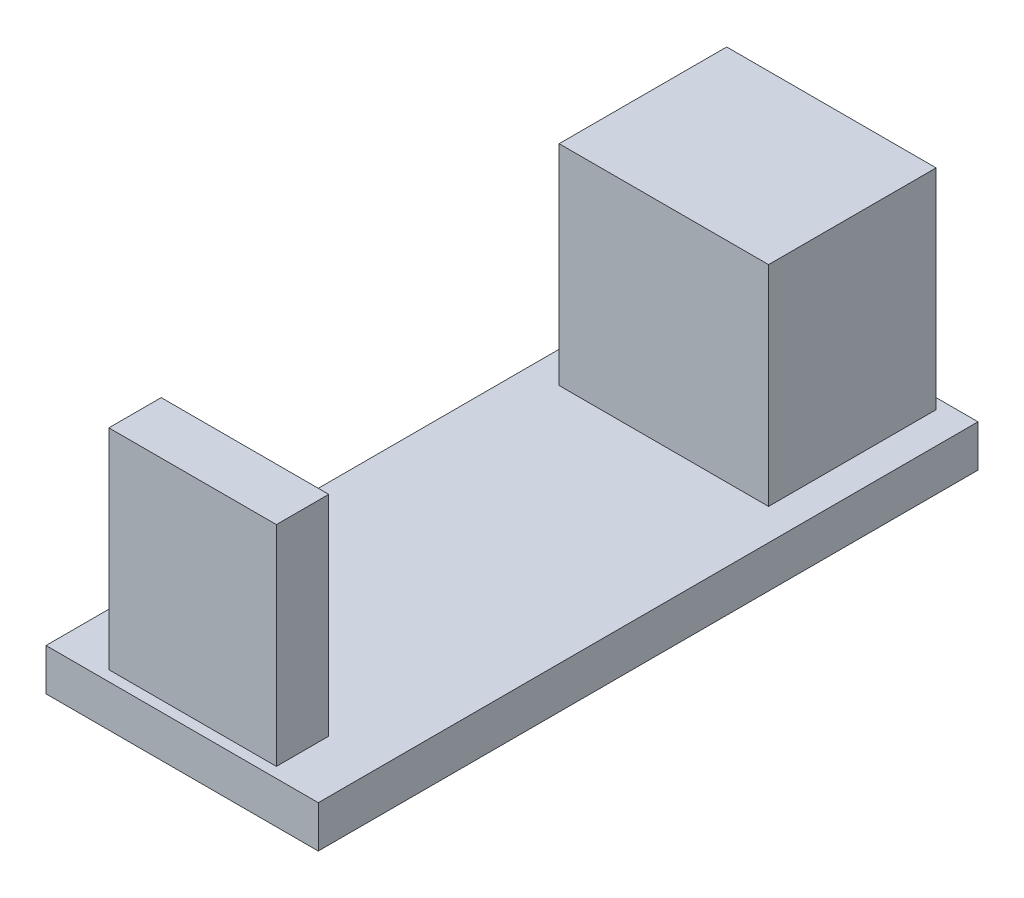
ISO-10303-21;
HEADER;
FILE_DESCRIPTION(('STEP AP214'),'2;1');
FILE_NAME('part.step','',(''),(''),'','','');
FILE_SCHEMA(('AUTOMOTIVE_DESIGN { 1 0 10303 214 1 1 1 1 }'));
ENDSEC;
DATA;
#1=APPLICATION_CONTEXT('core data for automotive mechanical design processes');
#2=APPLICATION_PROTOCOL_DEFINITION('international standard','automotive_design',2000,#1);
#3=PRODUCT_CONTEXT('',#1,'mechanical');
#4=PRODUCT('Part','Part','',(#3));
#5=PRODUCT_RELATED_PRODUCT_CATEGORY('part','',(#4));
#6=PRODUCT_DEFINITION_FORMATION('','',#4);
#7=PRODUCT_DEFINITION_CONTEXT('part definition',#1,'design');
#8=PRODUCT_DEFINITION('design','',#6,#7);
#9=PRODUCT_DEFINITION_SHAPE('','',#8);
#10=(LENGTH_UNIT() NAMED_UNIT(*) SI_UNIT(.MILLI.,.METRE.));
#11=(NAMED_UNIT(*) PLANE_ANGLE_UNIT() SI_UNIT($,.RADIAN.));
#12=(NAMED_UNIT(*) SI_UNIT($,.STERADIAN.) SOLID_ANGLE_UNIT());
#13=UNCERTAINTY_MEASURE_WITH_UNIT(LENGTH_MEASURE(1.E-05),#10,'distance_accuracy_value','');
#14=(GEOMETRIC_REPRESENTATION_CONTEXT(3) GLOBAL_UNCERTAINTY_ASSIGNED_CONTEXT((#13)) GLOBAL_UNIT_ASSIGNED_CONTEXT((#10,
#11,#12)) REPRESENTATION_CONTEXT('',''));
#15=CARTESIAN_POINT('',(0.,0.,0.));
#16=DIRECTION('',(0.,0.,1.));
#17=DIRECTION('',(1.,0.,0.));
#18=AXIS2_PLACEMENT_3D('',#15,#16,#17);
#19=CARTESIAN_POINT('',(0.,2.,0.));
#20=DIRECTION('',(0.,1.,0.));
#21=DIRECTION('',(0.,0.,1.));
#22=AXIS2_PLACEMENT_3D('',#19,#20,#21);
#23=PLANE('',#22);
#24=DIRECTION('',(0.,0.,-1.));
#25=VECTOR('',#24,1.);
#26=CARTESIAN_POINT('',(6.5,2.,-15.75));
#27=LINE('',#26,#25);
#28=CARTESIAN_POINT('',(6.5,2.,15.75));
#29=VERTEX_POINT('',#28);
#30=CARTESIAN_POINT('',(6.5,2.,-15.75));
#31=VERTEX_POINT('',#30);
#32=EDGE_CURVE('E179',#29,#31,#27,.T.);
#33=ORIENTED_EDGE('',*,*,#32,.T.);
#34=DIRECTION('',(-1.,0.,0.));
#35=VECTOR('',#34,1.);
#36=CARTESIAN_POINT('',(-6.5,2.,-15.75));
#37=LINE('',#36,#35);
#38=CARTESIAN_POINT('',(-6.5,2.,-15.75));
#39=VERTEX_POINT('',#38);
#40=EDGE_CURVE('E182',#31,#39,#37,.T.);
#41=ORIENTED_EDGE('',*,*,#40,.T.);
#42=DIRECTION('',(0.,0.,1.));
#43=VECTOR('',#42,1.);
#44=CARTESIAN_POINT('',(-6.5,2.,-15.75));
#45=LINE('',#44,#43);
#46=CARTESIAN_POINT('',(-6.5,2.,15.75));
#47=VERTEX_POINT('',#46);
#48=EDGE_CURVE('E185',#39,#47,#45,.T.);
#49=ORIENTED_EDGE('',*,*,#48,.T.);
#50=DIRECTION('',(1.,0.,0.));
#51=VECTOR('',#50,1.);
#52=CARTESIAN_POINT('',(-6.5,2.,15.75));
#53=LINE('',#52,#51);
#54=EDGE_CURVE('E187',#47,#29,#53,.T.);
#55=ORIENTED_EDGE('',*,*,#54,.T.);
#56=EDGE_LOOP('',(#33,#41,#49,#55));
#57=FACE_BOUND('',#56,.T.);
#58=DIRECTION('',(-1.,0.,0.));
#59=VECTOR('',#58,1.);
#60=CARTESIAN_POINT('',(-5.,2.,-15.25));
#61=LINE('',#60,#59);
#62=CARTESIAN_POINT('',(5.,2.,-15.25));
#63=VERTEX_POINT('',#62);
#64=CARTESIAN_POINT('',(-5.,2.,-15.25));
#65=VERTEX_POINT('',#64);
#66=EDGE_CURVE('E150',#63,#65,#61,.T.);
#67=ORIENTED_EDGE('',*,*,#66,.F.);
#68=DIRECTION('',(0.,0.,-1.));
#69=VECTOR('',#68,1.);
#70=CARTESIAN_POINT('',(5.,2.,-7.25));
#71=LINE('',#70,#69);
#72=CARTESIAN_POINT('',(5.,2.,-7.25));
#73=VERTEX_POINT('',#72);
#74=EDGE_CURVE('E147',#73,#63,#71,.T.);
#75=ORIENTED_EDGE('',*,*,#74,.F.);
#76=DIRECTION('',(1.,0.,0.));
#77=VECTOR('',#76,1.);
#78=CARTESIAN_POINT('',(-5.,2.,-7.25));
#79=LINE('',#78,#77);
#80=CARTESIAN_POINT('',(-5.,2.,-7.25));
#81=VERTEX_POINT('',#80);
#82=EDGE_CURVE('E159',#81,#73,#79,.T.);
#83=ORIENTED_EDGE('',*,*,#82,.F.);
#84=DIRECTION('',(0.,0.,1.));
#85=VECTOR('',#84,1.);
#86=CARTESIAN_POINT('',(-5.,2.,-7.25));
#87=LINE('',#86,#85);
#88=EDGE_CURVE('E167',#65,#81,#87,.T.);
#89=ORIENTED_EDGE('',*,*,#88,.F.);
#90=EDGE_LOOP('',(#67,#75,#83,#89));
#91=FACE_BOUND('',#90,.T.);
#92=DIRECTION('',(-1.,0.,0.));
#93=VECTOR('',#92,1.);
#94=CARTESIAN_POINT('',(-4.,2.,12.75));
#95=LINE('',#94,#93);
#96=CARTESIAN_POINT('',(4.,2.,12.75));
#97=VERTEX_POINT('',#96);
#98=CARTESIAN_POINT('',(-4.,2.,12.75));
#99=VERTEX_POINT('',#98);
#100=EDGE_CURVE('E368',#97,#99,#95,.T.);
#101=ORIENTED_EDGE('',*,*,#100,.F.);
#102=DIRECTION('',(0.,0.,-1.));
#103=VECTOR('',#102,1.);
#104=CARTESIAN_POINT('',(4.,2.,12.75));
#105=LINE('',#104,#103);
#106=CARTESIAN_POINT('',(4.,2.,15.25));
#107=VERTEX_POINT('',#106);
#108=EDGE_CURVE('E145',#107,#97,#105,.T.);
#109=ORIENTED_EDGE('',*,*,#108,.F.);
#110=DIRECTION('',(1.,0.,0.));
#111=VECTOR('',#110,1.);
#112=CARTESIAN_POINT('',(-4.,2.,15.25));
#113=LINE('',#112,#111);
#114=CARTESIAN_POINT('',(-4.,2.,15.25));
#115=VERTEX_POINT('',#114);
#116=EDGE_CURVE('E141',#115,#107,#113,.T.);
#117=ORIENTED_EDGE('',*,*,#116,.F.);
#118=DIRECTION('',(0.,0.,1.));
#119=VECTOR('',#118,1.);
#120=CARTESIAN_POINT('',(-4.,2.,12.75));
#121=LINE('',#120,#119);
#122=EDGE_CURVE('E365',#99,#115,#121,.T.);
#123=ORIENTED_EDGE('',*,*,#122,.F.);
#124=EDGE_LOOP('',(#101,#109,#117,#123));
#125=FACE_BOUND('',#124,.T.);
#126=ADVANCED_FACE('F32',(#57,#91,#125),#23,.T.);
#127=CARTESIAN_POINT('',(6.5,2.,-15.75));
#128=DIRECTION('',(-1.,0.,0.));
#129=DIRECTION('',(0.,0.,1.));
#130=AXIS2_PLACEMENT_3D('',#127,#128,#129);
#131=PLANE('',#130);
#132=DIRECTION('',(0.,0.,-1.));
#133=VECTOR('',#132,1.);
#134=CARTESIAN_POINT('',(6.5,0.,-15.75));
#135=LINE('',#134,#133);
#136=CARTESIAN_POINT('',(6.5,0.,15.75));
#137=VERTEX_POINT('',#136);
#138=CARTESIAN_POINT('',(6.5,0.,-15.75));
#139=VERTEX_POINT('',#138);
#140=EDGE_CURVE('E178',#137,#139,#135,.T.);
#141=ORIENTED_EDGE('',*,*,#140,.T.);
#142=DIRECTION('',(0.,-1.,0.));
#143=VECTOR('',#142,1.);
#144=CARTESIAN_POINT('',(6.5,2.,-15.75));
#145=LINE('',#144,#143);
#146=EDGE_CURVE('E11',#31,#139,#145,.T.);
#147=ORIENTED_EDGE('',*,*,#146,.F.);
#148=ORIENTED_EDGE('',*,*,#32,.F.);
#149=DIRECTION('',(0.,-1.,0.));
#150=VECTOR('',#149,1.);
#151=CARTESIAN_POINT('',(6.5,2.,15.75));
#152=LINE('',#151,#150);
#153=EDGE_CURVE('E189',#29,#137,#152,.T.);
#154=ORIENTED_EDGE('',*,*,#153,.T.);
#155=EDGE_LOOP('',(#141,#147,#148,#154));
#156=FACE_BOUND('',#155,.T.);
#157=ADVANCED_FACE('F34',(#156),#131,.F.);
#158=CARTESIAN_POINT('',(-6.5,2.,-15.75));
#159=DIRECTION('',(0.,0.,1.));
#160=DIRECTION('',(1.,0.,0.));
#161=AXIS2_PLACEMENT_3D('',#158,#159,#160);
#162=PLANE('',#161);
#163=DIRECTION('',(-1.,0.,0.));
#164=VECTOR('',#163,1.);
#165=CARTESIAN_POINT('',(-6.5,0.,-15.75));
#166=LINE('',#165,#164);
#167=CARTESIAN_POINT('',(-6.5,0.,-15.75));
#168=VERTEX_POINT('',#167);
#169=EDGE_CURVE('E192',#139,#168,#166,.T.);
#170=ORIENTED_EDGE('',*,*,#169,.T.);
#171=DIRECTION('',(0.,-1.,0.));
#172=VECTOR('',#171,1.);
#173=CARTESIAN_POINT('',(-6.5,2.,-15.75));
#174=LINE('',#173,#172);
#175=EDGE_CURVE('E40',#39,#168,#174,.T.);
#176=ORIENTED_EDGE('',*,*,#175,.F.);
#177=ORIENTED_EDGE('',*,*,#40,.F.);
#178=ORIENTED_EDGE('',*,*,#146,.T.);
#179=EDGE_LOOP('',(#170,#176,#177,#178));
#180=FACE_BOUND('',#179,.T.);
#181=ADVANCED_FACE('F222',(#180),#162,.F.);
#182=CARTESIAN_POINT('',(-6.5,2.,-15.75));
#183=DIRECTION('',(1.,0.,0.));
#184=DIRECTION('',(0.,0.,-1.));
#185=AXIS2_PLACEMENT_3D('',#182,#183,#184);
#186=PLANE('',#185);
#187=DIRECTION('',(0.,0.,1.));
#188=VECTOR('',#187,1.);
#189=CARTESIAN_POINT('',(-6.5,0.,-15.75));
#190=LINE('',#189,#188);
#191=CARTESIAN_POINT('',(-6.5,0.,15.75));
#192=VERTEX_POINT('',#191);
#193=EDGE_CURVE('E194',#168,#192,#190,.T.);
#194=ORIENTED_EDGE('',*,*,#193,.T.);
#195=DIRECTION('',(0.,-1.,0.));
#196=VECTOR('',#195,1.);
#197=CARTESIAN_POINT('',(-6.5,2.,15.75));
#198=LINE('',#197,#196);
#199=EDGE_CURVE('E199',#47,#192,#198,.T.);
#200=ORIENTED_EDGE('',*,*,#199,.F.);
#201=ORIENTED_EDGE('',*,*,#48,.F.);
#202=ORIENTED_EDGE('',*,*,#175,.T.);
#203=EDGE_LOOP('',(#194,#200,#201,#202));
#204=FACE_BOUND('',#203,.T.);
#205=ADVANCED_FACE('F206',(#204),#186,.F.);
#206=CARTESIAN_POINT('',(-6.5,2.,15.75));
#207=DIRECTION('',(0.,0.,-1.));
#208=DIRECTION('',(-1.,0.,0.));
#209=AXIS2_PLACEMENT_3D('',#206,#207,#208);
#210=PLANE('',#209);
#211=DIRECTION('',(1.,0.,0.));
#212=VECTOR('',#211,1.);
#213=CARTESIAN_POINT('',(-6.5,0.,15.75));
#214=LINE('',#213,#212);
#215=EDGE_CURVE('E183',#192,#137,#214,.T.);
#216=ORIENTED_EDGE('',*,*,#215,.T.);
#217=ORIENTED_EDGE('',*,*,#153,.F.);
#218=ORIENTED_EDGE('',*,*,#54,.F.);
#219=ORIENTED_EDGE('',*,*,#199,.T.);
#220=EDGE_LOOP('',(#216,#217,#218,#219));
#221=FACE_BOUND('',#220,.T.);
#222=ADVANCED_FACE('F215',(#221),#210,.F.);
#223=CARTESIAN_POINT('',(0.,0.,0.));
#224=DIRECTION('',(0.,1.,0.));
#225=DIRECTION('',(0.,0.,1.));
#226=AXIS2_PLACEMENT_3D('',#223,#224,#225);
#227=PLANE('',#226);
#228=ORIENTED_EDGE('',*,*,#140,.F.);
#229=ORIENTED_EDGE('',*,*,#215,.F.);
#230=ORIENTED_EDGE('',*,*,#193,.F.);
#231=ORIENTED_EDGE('',*,*,#169,.F.);
#232=EDGE_LOOP('',(#228,#229,#230,#231));
#233=FACE_BOUND('',#232,.T.);
#234=ADVANCED_FACE('F212',(#233),#227,.F.);
#235=CARTESIAN_POINT('',(5.,12.,-7.25));
#236=DIRECTION('',(-1.,0.,0.));
#237=DIRECTION('',(0.,0.,1.));
#238=AXIS2_PLACEMENT_3D('',#235,#236,#237);
#239=PLANE('',#238);
#240=ORIENTED_EDGE('',*,*,#74,.T.);
#241=DIRECTION('',(0.,-1.,0.));
#242=VECTOR('',#241,1.);
#243=CARTESIAN_POINT('',(5.,12.,-15.25));
#244=LINE('',#243,#242);
#245=CARTESIAN_POINT('',(5.,12.,-15.25));
#246=VERTEX_POINT('',#245);
#247=EDGE_CURVE('E176',#246,#63,#244,.T.);
#248=ORIENTED_EDGE('',*,*,#247,.F.);
#249=DIRECTION('',(0.,0.,-1.));
#250=VECTOR('',#249,1.);
#251=CARTESIAN_POINT('',(5.,12.,-7.25));
#252=LINE('',#251,#250);
#253=CARTESIAN_POINT('',(5.,12.,-7.25));
#254=VERTEX_POINT('',#253);
#255=EDGE_CURVE('E155',#254,#246,#252,.T.);
#256=ORIENTED_EDGE('',*,*,#255,.F.);
#257=DIRECTION('',(0.,-1.,0.));
#258=VECTOR('',#257,1.);
#259=CARTESIAN_POINT('',(5.,12.,-7.25));
#260=LINE('',#259,#258);
#261=EDGE_CURVE('E164',#254,#73,#260,.T.);
#262=ORIENTED_EDGE('',*,*,#261,.T.);
#263=EDGE_LOOP('',(#240,#248,#256,#262));
#264=FACE_BOUND('',#263,.T.);
#265=ADVANCED_FACE('F235',(#264),#239,.F.);
#266=CARTESIAN_POINT('',(-5.,12.,-15.25));
#267=DIRECTION('',(0.,0.,1.));
#268=DIRECTION('',(1.,0.,0.));
#269=AXIS2_PLACEMENT_3D('',#266,#267,#268);
#270=PLANE('',#269);
#271=ORIENTED_EDGE('',*,*,#66,.T.);
#272=DIRECTION('',(0.,-1.,0.));
#273=VECTOR('',#272,1.);
#274=CARTESIAN_POINT('',(-5.,12.,-15.25));
#275=LINE('',#274,#273);
#276=CARTESIAN_POINT('',(-5.,12.,-15.25));
#277=VERTEX_POINT('',#276);
#278=EDGE_CURVE('E173',#277,#65,#275,.T.);
#279=ORIENTED_EDGE('',*,*,#278,.F.);
#280=DIRECTION('',(-1.,0.,0.));
#281=VECTOR('',#280,1.);
#282=CARTESIAN_POINT('',(-5.,12.,-15.25));
#283=LINE('',#282,#281);
#284=EDGE_CURVE('E158',#246,#277,#283,.T.);
#285=ORIENTED_EDGE('',*,*,#284,.F.);
#286=ORIENTED_EDGE('',*,*,#247,.T.);
#287=EDGE_LOOP('',(#271,#279,#285,#286));
#288=FACE_BOUND('',#287,.T.);
#289=ADVANCED_FACE('F254',(#288),#270,.F.);
#290=CARTESIAN_POINT('',(-5.,12.,-7.25));
#291=DIRECTION('',(1.,0.,0.));
#292=DIRECTION('',(0.,0.,-1.));
#293=AXIS2_PLACEMENT_3D('',#290,#291,#292);
#294=PLANE('',#293);
#295=ORIENTED_EDGE('',*,*,#88,.T.);
#296=DIRECTION('',(0.,-1.,0.));
#297=VECTOR('',#296,1.);
#298=CARTESIAN_POINT('',(-5.,12.,-7.25));
#299=LINE('',#298,#297);
#300=CARTESIAN_POINT('',(-5.,12.,-7.25));
#301=VERTEX_POINT('',#300);
#302=EDGE_CURVE('E55',#301,#81,#299,.T.);
#303=ORIENTED_EDGE('',*,*,#302,.F.);
#304=DIRECTION('',(0.,0.,1.));
#305=VECTOR('',#304,1.);
#306=CARTESIAN_POINT('',(-5.,12.,-7.25));
#307=LINE('',#306,#305);
#308=EDGE_CURVE('E161',#277,#301,#307,.T.);
#309=ORIENTED_EDGE('',*,*,#308,.F.);
#310=ORIENTED_EDGE('',*,*,#278,.T.);
#311=EDGE_LOOP('',(#295,#303,#309,#310));
#312=FACE_BOUND('',#311,.T.);
#313=ADVANCED_FACE('F261',(#312),#294,.F.);
#314=CARTESIAN_POINT('',(-5.,12.,-7.25));
#315=DIRECTION('',(0.,0.,-1.));
#316=DIRECTION('',(-1.,0.,0.));
#317=AXIS2_PLACEMENT_3D('',#314,#315,#316);
#318=PLANE('',#317);
#319=ORIENTED_EDGE('',*,*,#82,.T.);
#320=ORIENTED_EDGE('',*,*,#261,.F.);
#321=DIRECTION('',(1.,0.,0.));
#322=VECTOR('',#321,1.);
#323=CARTESIAN_POINT('',(-5.,12.,-7.25));
#324=LINE('',#323,#322);
#325=EDGE_CURVE('E163',#301,#254,#324,.T.);
#326=ORIENTED_EDGE('',*,*,#325,.F.);
#327=ORIENTED_EDGE('',*,*,#302,.T.);
#328=EDGE_LOOP('',(#319,#320,#326,#327));
#329=FACE_BOUND('',#328,.T.);
#330=ADVANCED_FACE('F268',(#329),#318,.F.);
#331=CARTESIAN_POINT('',(0.,12.,0.));
#332=DIRECTION('',(0.,-1.,0.));
#333=DIRECTION('',(0.,0.,-1.));
#334=AXIS2_PLACEMENT_3D('',#331,#332,#333);
#335=PLANE('',#334);
#336=ORIENTED_EDGE('',*,*,#255,.T.);
#337=ORIENTED_EDGE('',*,*,#284,.T.);
#338=ORIENTED_EDGE('',*,*,#308,.T.);
#339=ORIENTED_EDGE('',*,*,#325,.T.);
#340=EDGE_LOOP('',(#336,#337,#338,#339));
#341=FACE_BOUND('',#340,.T.);
#342=ADVANCED_FACE('F276',(#341),#335,.F.);
#343=CARTESIAN_POINT('',(4.,12.,12.75));
#344=DIRECTION('',(-1.,0.,0.));
#345=DIRECTION('',(0.,0.,1.));
#346=AXIS2_PLACEMENT_3D('',#343,#344,#345);
#347=PLANE('',#346);
#348=ORIENTED_EDGE('',*,*,#108,.T.);
#349=DIRECTION('',(0.,-1.,0.));
#350=VECTOR('',#349,1.);
#351=CARTESIAN_POINT('',(4.,12.,12.75));
#352=LINE('',#351,#350);
#353=CARTESIAN_POINT('',(4.,12.,12.75));
#354=VERTEX_POINT('',#353);
#355=EDGE_CURVE('E126',#354,#97,#352,.T.);
#356=ORIENTED_EDGE('',*,*,#355,.F.);
#357=DIRECTION('',(0.,0.,-1.));
#358=VECTOR('',#357,1.);
#359=CARTESIAN_POINT('',(4.,12.,12.75));
#360=LINE('',#359,#358);
#361=CARTESIAN_POINT('',(4.,12.,15.25));
#362=VERTEX_POINT('',#361);
#363=EDGE_CURVE('E133',#362,#354,#360,.T.);
#364=ORIENTED_EDGE('',*,*,#363,.F.);
#365=DIRECTION('',(0.,-1.,0.));
#366=VECTOR('',#365,1.);
#367=CARTESIAN_POINT('',(4.,12.,15.25));
#368=LINE('',#367,#366);
#369=EDGE_CURVE('E362',#362,#107,#368,.T.);
#370=ORIENTED_EDGE('',*,*,#369,.T.);
#371=EDGE_LOOP('',(#348,#356,#364,#370));
#372=FACE_BOUND('',#371,.T.);
#373=ADVANCED_FACE('F143',(#372),#347,.F.);
#374=CARTESIAN_POINT('',(-4.,12.,12.75));
#375=DIRECTION('',(0.,0.,1.));
#376=DIRECTION('',(1.,0.,0.));
#377=AXIS2_PLACEMENT_3D('',#374,#375,#376);
#378=PLANE('',#377);
#379=ORIENTED_EDGE('',*,*,#100,.T.);
#380=DIRECTION('',(0.,-1.,0.));
#381=VECTOR('',#380,1.);
#382=CARTESIAN_POINT('',(-4.,12.,12.75));
#383=LINE('',#382,#381);
#384=CARTESIAN_POINT('',(-4.,12.,12.75));
#385=VERTEX_POINT('',#384);
#386=EDGE_CURVE('E129',#385,#99,#383,.T.);
#387=ORIENTED_EDGE('',*,*,#386,.F.);
#388=DIRECTION('',(-1.,0.,0.));
#389=VECTOR('',#388,1.);
#390=CARTESIAN_POINT('',(-4.,12.,12.75));
#391=LINE('',#390,#389);
#392=EDGE_CURVE('E122',#354,#385,#391,.T.);
#393=ORIENTED_EDGE('',*,*,#392,.F.);
#394=ORIENTED_EDGE('',*,*,#355,.T.);
#395=EDGE_LOOP('',(#379,#387,#393,#394));
#396=FACE_BOUND('',#395,.T.);
#397=ADVANCED_FACE('F124',(#396),#378,.F.);
#398=CARTESIAN_POINT('',(-4.,12.,12.75));
#399=DIRECTION('',(1.,0.,0.));
#400=DIRECTION('',(0.,0.,-1.));
#401=AXIS2_PLACEMENT_3D('',#398,#399,#400);
#402=PLANE('',#401);
#403=ORIENTED_EDGE('',*,*,#122,.T.);
#404=DIRECTION('',(0.,-1.,0.));
#405=VECTOR('',#404,1.);
#406=CARTESIAN_POINT('',(-4.,12.,15.25));
#407=LINE('',#406,#405);
#408=CARTESIAN_POINT('',(-4.,12.,15.25));
#409=VERTEX_POINT('',#408);
#410=EDGE_CURVE('E47',#409,#115,#407,.T.);
#411=ORIENTED_EDGE('',*,*,#410,.F.);
#412=DIRECTION('',(0.,0.,1.));
#413=VECTOR('',#412,1.);
#414=CARTESIAN_POINT('',(-4.,12.,12.75));
#415=LINE('',#414,#413);
#416=EDGE_CURVE('E132',#385,#409,#415,.T.);
#417=ORIENTED_EDGE('',*,*,#416,.F.);
#418=ORIENTED_EDGE('',*,*,#386,.T.);
#419=EDGE_LOOP('',(#403,#411,#417,#418));
#420=FACE_BOUND('',#419,.T.);
#421=ADVANCED_FACE('F296',(#420),#402,.F.);
#422=CARTESIAN_POINT('',(-4.,12.,15.25));
#423=DIRECTION('',(0.,0.,-1.));
#424=DIRECTION('',(-1.,0.,0.));
#425=AXIS2_PLACEMENT_3D('',#422,#423,#424);
#426=PLANE('',#425);
#427=ORIENTED_EDGE('',*,*,#116,.T.);
#428=ORIENTED_EDGE('',*,*,#369,.F.);
#429=DIRECTION('',(1.,0.,0.));
#430=VECTOR('',#429,1.);
#431=CARTESIAN_POINT('',(-4.,12.,15.25));
#432=LINE('',#431,#430);
#433=EDGE_CURVE('E137',#409,#362,#432,.T.);
#434=ORIENTED_EDGE('',*,*,#433,.F.);
#435=ORIENTED_EDGE('',*,*,#410,.T.);
#436=EDGE_LOOP('',(#427,#428,#434,#435));
#437=FACE_BOUND('',#436,.T.);
#438=ADVANCED_FACE('F303',(#437),#426,.F.);
#439=CARTESIAN_POINT('',(0.,12.,0.));
#440=DIRECTION('',(0.,1.,0.));
#441=DIRECTION('',(0.,0.,1.));
#442=AXIS2_PLACEMENT_3D('',#439,#440,#441);
#443=PLANE('',#442);
#444=ORIENTED_EDGE('',*,*,#363,.T.);
#445=ORIENTED_EDGE('',*,*,#392,.T.);
#446=ORIENTED_EDGE('',*,*,#416,.T.);
#447=ORIENTED_EDGE('',*,*,#433,.T.);
#448=EDGE_LOOP('',(#444,#445,#446,#447));
#449=FACE_BOUND('',#448,.T.);
#450=ADVANCED_FACE('F136',(#449),#443,.T.);
#451=CLOSED_SHELL('',(#126,#157,#181,#205,#222,#234,#265,#289,#313,#330,#342,#373,#397,#421,
#438,#450));
#452=MANIFOLD_SOLID_BREP('B2',#451);
#453=ADVANCED_BREP_SHAPE_REPRESENTATION('',(#18,#452),#14);
#454=SHAPE_DEFINITION_REPRESENTATION(#9,#453);
ENDSEC;
END-ISO-10303-21;
